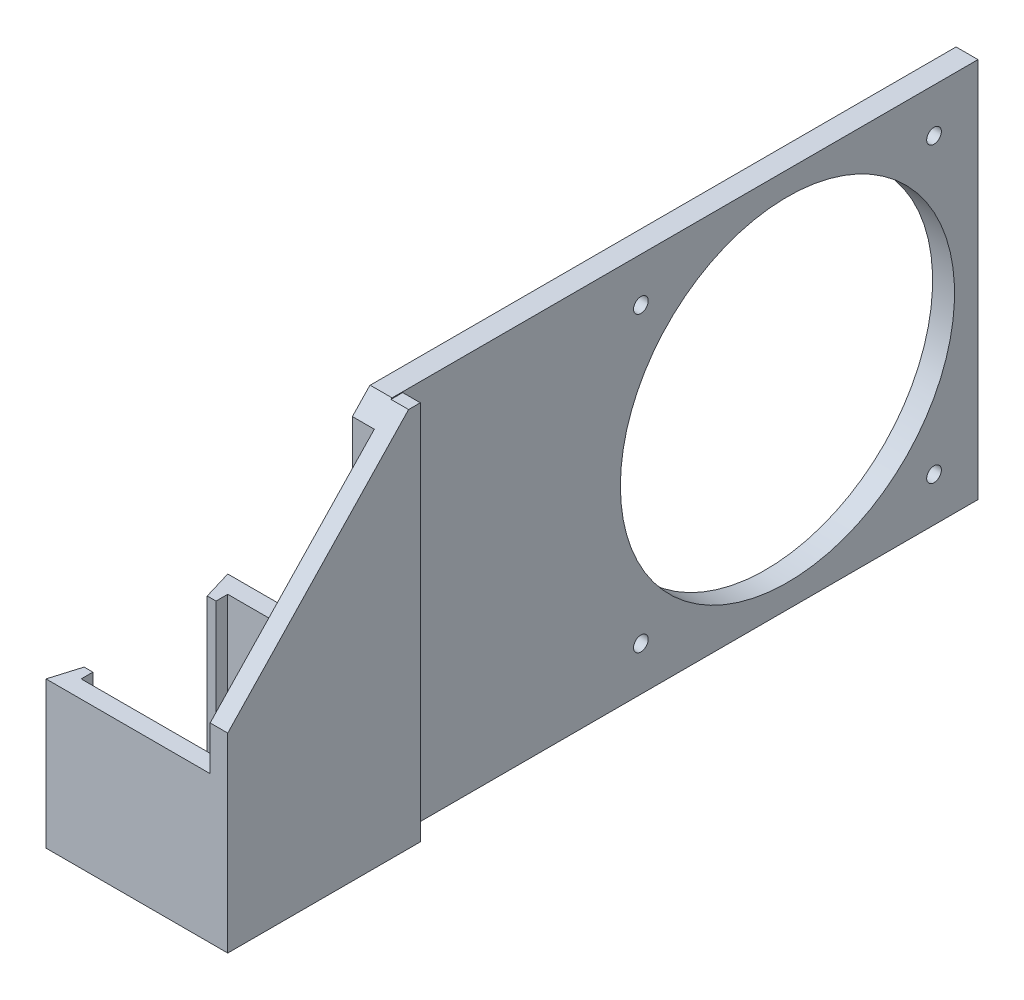
ISO-10303-21;
HEADER;
FILE_DESCRIPTION(('STEP AP214'),'2;1');
FILE_NAME('part.step','',(''),(''),'','','');
FILE_SCHEMA(('AUTOMOTIVE_DESIGN { 1 0 10303 214 1 1 1 1 }'));
ENDSEC;
DATA;
#1=APPLICATION_CONTEXT('core data for automotive mechanical design processes');
#2=APPLICATION_PROTOCOL_DEFINITION('international standard','automotive_design',2000,#1);
#3=PRODUCT_CONTEXT('',#1,'mechanical');
#4=PRODUCT('Part','Part','',(#3));
#5=PRODUCT_RELATED_PRODUCT_CATEGORY('part','',(#4));
#6=PRODUCT_DEFINITION_FORMATION('','',#4);
#7=PRODUCT_DEFINITION_CONTEXT('part definition',#1,'design');
#8=PRODUCT_DEFINITION('design','',#6,#7);
#9=PRODUCT_DEFINITION_SHAPE('','',#8);
#10=(LENGTH_UNIT() NAMED_UNIT(*) SI_UNIT(.MILLI.,.METRE.));
#11=(NAMED_UNIT(*) PLANE_ANGLE_UNIT() SI_UNIT($,.RADIAN.));
#12=(NAMED_UNIT(*) SI_UNIT($,.STERADIAN.) SOLID_ANGLE_UNIT());
#13=UNCERTAINTY_MEASURE_WITH_UNIT(LENGTH_MEASURE(1.E-05),#10,'distance_accuracy_value','');
#14=(GEOMETRIC_REPRESENTATION_CONTEXT(3) GLOBAL_UNCERTAINTY_ASSIGNED_CONTEXT((#13)) GLOBAL_UNIT_ASSIGNED_CONTEXT((#10,
#11,#12)) REPRESENTATION_CONTEXT('',''));
#15=CARTESIAN_POINT('',(0.,0.,0.));
#16=DIRECTION('',(0.,0.,1.));
#17=DIRECTION('',(1.,0.,0.));
#18=AXIS2_PLACEMENT_3D('',#15,#16,#17);
#19=CARTESIAN_POINT('',(-38.8257575757576,65.,-34.8134556664977));
#20=DIRECTION('',(-1.,0.,0.));
#21=DIRECTION('',(0.,0.,1.));
#22=AXIS2_PLACEMENT_3D('',#19,#20,#21);
#23=PLANE('',#22);
#24=CARTESIAN_POINT('',(-38.8257575757576,57.5,-77.4382664031757));
#25=DIRECTION('',(-1.,0.,0.));
#26=DIRECTION('',(0.,0.,1.));
#27=AXIS2_PLACEMENT_3D('',#24,#25,#26);
#28=CIRCLE('',#27,1.25);
#29=CARTESIAN_POINT('',(-38.8257575757576,57.5,-76.1882664031757));
#30=VERTEX_POINT('',#29);
#31=EDGE_CURVE('E278',#30,#30,#28,.F.);
#32=ORIENTED_EDGE('',*,*,#31,.F.);
#33=EDGE_LOOP('',(#32));
#34=FACE_BOUND('',#33,.T.);
#35=CARTESIAN_POINT('',(-38.8257575757576,7.49999999999999,-127.438266403176));
#36=DIRECTION('',(-1.,0.,0.));
#37=DIRECTION('',(0.,0.,1.));
#38=AXIS2_PLACEMENT_3D('',#35,#36,#37);
#39=CIRCLE('',#38,1.25000000000001);
#40=CARTESIAN_POINT('',(-38.8257575757576,7.49999999999999,-126.188266403176));
#41=VERTEX_POINT('',#40);
#42=EDGE_CURVE('E272',#41,#41,#39,.F.);
#43=ORIENTED_EDGE('',*,*,#42,.F.);
#44=EDGE_LOOP('',(#43));
#45=FACE_BOUND('',#44,.T.);
#46=CARTESIAN_POINT('',(-38.8257575757576,7.49999999999999,-77.4382664031757));
#47=DIRECTION('',(-1.,0.,0.));
#48=DIRECTION('',(0.,0.,1.));
#49=AXIS2_PLACEMENT_3D('',#46,#47,#48);
#50=CIRCLE('',#49,1.25);
#51=CARTESIAN_POINT('',(-38.8257575757576,7.49999999999999,-76.1882664031757));
#52=VERTEX_POINT('',#51);
#53=EDGE_CURVE('E271',#52,#52,#50,.F.);
#54=ORIENTED_EDGE('',*,*,#53,.F.);
#55=EDGE_LOOP('',(#54));
#56=FACE_BOUND('',#55,.T.);
#57=CARTESIAN_POINT('',(-38.8257575757576,57.5,-127.438266403176));
#58=DIRECTION('',(-1.,0.,0.));
#59=DIRECTION('',(0.,0.,1.));
#60=AXIS2_PLACEMENT_3D('',#57,#58,#59);
#61=CIRCLE('',#60,1.25000000000001);
#62=CARTESIAN_POINT('',(-38.8257575757576,57.5,-126.188266403176));
#63=VERTEX_POINT('',#62);
#64=EDGE_CURVE('E275',#63,#63,#61,.F.);
#65=ORIENTED_EDGE('',*,*,#64,.F.);
#66=EDGE_LOOP('',(#65));
#67=FACE_BOUND('',#66,.T.);
#68=CARTESIAN_POINT('',(-38.8257575757576,32.5,-102.438266403176));
#69=DIRECTION('',(-1.,0.,0.));
#70=DIRECTION('',(0.,0.,1.));
#71=AXIS2_PLACEMENT_3D('',#68,#69,#70);
#72=CIRCLE('',#71,28.5);
#73=CARTESIAN_POINT('',(-38.8257575757576,32.5,-73.9382664031757));
#74=VERTEX_POINT('',#73);
#75=EDGE_CURVE('E281',#74,#74,#72,.F.);
#76=ORIENTED_EDGE('',*,*,#75,.F.);
#77=EDGE_LOOP('',(#76));
#78=FACE_BOUND('',#77,.T.);
#79=DIRECTION('',(0.,0.,1.));
#80=VECTOR('',#79,1.);
#81=CARTESIAN_POINT('',(-38.8257575757576,64.8690170509813,-36.8134556664977));
#82=LINE('',#81,#80);
#83=CARTESIAN_POINT('',(-38.8257575757576,64.8690170509813,-36.8134556664977));
#84=VERTEX_POINT('',#83);
#85=CARTESIAN_POINT('',(-38.8257575757576,64.8690170509813,-34.8134556664977));
#86=VERTEX_POINT('',#85);
#87=EDGE_CURVE('E53',#84,#86,#82,.T.);
#88=ORIENTED_EDGE('',*,*,#87,.F.);
#89=DIRECTION('',(0.,1.,0.));
#90=VECTOR('',#89,1.);
#91=CARTESIAN_POINT('',(-38.8257575757576,64.8690170509813,-36.8134556664977));
#92=LINE('',#91,#90);
#93=CARTESIAN_POINT('',(-38.8257575757576,0.,-36.8134556664977));
#94=VERTEX_POINT('',#93);
#95=EDGE_CURVE('E57',#94,#84,#92,.T.);
#96=ORIENTED_EDGE('',*,*,#95,.F.);
#97=DIRECTION('',(0.,0.,-1.));
#98=VECTOR('',#97,1.);
#99=CARTESIAN_POINT('',(-38.8257575757576,0.,-34.8134556664977));
#100=LINE('',#99,#98);
#101=CARTESIAN_POINT('',(-38.8257575757576,0.,-134.938266403176));
#102=VERTEX_POINT('',#101);
#103=EDGE_CURVE('E202',#94,#102,#100,.T.);
#104=ORIENTED_EDGE('',*,*,#103,.T.);
#105=DIRECTION('',(0.,-1.,0.));
#106=VECTOR('',#105,1.);
#107=CARTESIAN_POINT('',(-38.8257575757576,65.,-134.938266403176));
#108=LINE('',#107,#106);
#109=CARTESIAN_POINT('',(-38.8257575757576,65.,-134.938266403176));
#110=VERTEX_POINT('',#109);
#111=EDGE_CURVE('E267',#110,#102,#108,.T.);
#112=ORIENTED_EDGE('',*,*,#111,.F.);
#113=DIRECTION('',(0.,0.,-1.));
#114=VECTOR('',#113,1.);
#115=CARTESIAN_POINT('',(-38.8257575757576,65.,-34.8134556664977));
#116=LINE('',#115,#114);
#117=CARTESIAN_POINT('',(-38.8257575757576,65.,-34.9697397940122));
#118=VERTEX_POINT('',#117);
#119=EDGE_CURVE('E265',#118,#110,#116,.T.);
#120=ORIENTED_EDGE('',*,*,#119,.F.);
#121=DIRECTION('',(0.,-1.,0.));
#122=VECTOR('',#121,1.);
#123=CARTESIAN_POINT('',(-38.8257575757576,69.3298478640681,-34.9697397940122));
#124=LINE('',#123,#122);
#125=CARTESIAN_POINT('',(-38.8257575757576,65.0330298310635,-34.9697397940122));
#126=VERTEX_POINT('',#125);
#127=EDGE_CURVE('E231',#126,#118,#124,.T.);
#128=ORIENTED_EDGE('',*,*,#127,.F.);
#129=DIRECTION('',(0.,-0.72395829288421,0.689843743295669));
#130=VECTOR('',#129,1.);
#131=CARTESIAN_POINT('',(-38.8257575757576,67.2850592347853,-37.1156484867437));
#132=LINE('',#131,#130);
#133=EDGE_CURVE('E217',#126,#86,#132,.T.);
#134=ORIENTED_EDGE('',*,*,#133,.T.);
#135=EDGE_LOOP('',(#88,#96,#104,#112,#120,#128,#134));
#136=FACE_BOUND('',#135,.T.);
#137=ADVANCED_FACE('F37',(#34,#45,#56,#67,#78,#136),#23,.F.);
#138=CARTESIAN_POINT('',(0.,25.,0.));
#139=DIRECTION('',(0.,1.,0.));
#140=DIRECTION('',(0.,0.,1.));
#141=AXIS2_PLACEMENT_3D('',#138,#139,#140);
#142=PLANE('',#141);
#143=DIRECTION('',(1.,0.,0.));
#144=VECTOR('',#143,1.);
#145=CARTESIAN_POINT('',(-63.8257575757576,25.,-31.9697397940122));
#146=LINE('',#145,#144);
#147=CARTESIAN_POINT('',(-63.8257575757576,25.,-31.9697397940122));
#148=VERTEX_POINT('',#147);
#149=CARTESIAN_POINT('',(-42.5643312219053,25.,-31.9697397940122));
#150=VERTEX_POINT('',#149);
#151=EDGE_CURVE('E323',#148,#150,#146,.T.);
#152=ORIENTED_EDGE('',*,*,#151,.T.);
#153=DIRECTION('',(0.,0.,1.));
#154=VECTOR('',#153,1.);
#155=CARTESIAN_POINT('',(-42.5643312219053,25.,-34.9697397940122));
#156=LINE('',#155,#154);
#157=CARTESIAN_POINT('',(-42.5643312219053,25.,-44.9697397940123));
#158=VERTEX_POINT('',#157);
#159=EDGE_CURVE('E216',#158,#150,#156,.T.);
#160=ORIENTED_EDGE('',*,*,#159,.F.);
#161=DIRECTION('',(-0.707106781186544,0.,0.707106781186551));
#162=VECTOR('',#161,1.);
#163=CARTESIAN_POINT('',(-42.5643312219053,25.,-44.9697397940123));
#164=LINE('',#163,#162);
#165=CARTESIAN_POINT('',(-52.5643312219053,25.,-34.9697397940122));
#166=VERTEX_POINT('',#165);
#167=EDGE_CURVE('E46',#158,#166,#164,.T.);
#168=ORIENTED_EDGE('',*,*,#167,.T.);
#169=DIRECTION('',(-1.,0.,0.));
#170=VECTOR('',#169,1.);
#171=CARTESIAN_POINT('',(-36.5790075050805,25.,-34.9697397940122));
#172=LINE('',#171,#170);
#173=CARTESIAN_POINT('',(-66.8257575757576,25.,-34.9697397940122));
#174=VERTEX_POINT('',#173);
#175=EDGE_CURVE('E316',#166,#174,#172,.T.);
#176=ORIENTED_EDGE('',*,*,#175,.T.);
#177=DIRECTION('',(0.287347885566346,0.,0.957826285221151));
#178=VECTOR('',#177,1.);
#179=CARTESIAN_POINT('',(-66.8257575757576,25.,-34.9697397940122));
#180=LINE('',#179,#178);
#181=CARTESIAN_POINT('',(-65.3257575757576,25.,-29.9697397940122));
#182=VERTEX_POINT('',#181);
#183=EDGE_CURVE('E310',#174,#182,#180,.T.);
#184=ORIENTED_EDGE('',*,*,#183,.T.);
#185=DIRECTION('',(1.,0.,0.));
#186=VECTOR('',#185,1.);
#187=CARTESIAN_POINT('',(-66.8257575757576,25.,-29.9697397940122));
#188=LINE('',#187,#186);
#189=CARTESIAN_POINT('',(-63.8257575757576,25.,-29.9697397940122));
#190=VERTEX_POINT('',#189);
#191=EDGE_CURVE('E318',#182,#190,#188,.T.);
#192=ORIENTED_EDGE('',*,*,#191,.T.);
#193=DIRECTION('',(0.,0.,-1.));
#194=VECTOR('',#193,1.);
#195=CARTESIAN_POINT('',(-63.8257575757576,25.,-29.9697397940122));
#196=LINE('',#195,#194);
#197=EDGE_CURVE('E321',#190,#148,#196,.T.);
#198=ORIENTED_EDGE('',*,*,#197,.T.);
#199=EDGE_LOOP('',(#152,#160,#168,#176,#184,#192,#198));
#200=FACE_BOUND('',#199,.T.);
#201=ADVANCED_FACE('F389',(#200),#142,.T.);
#202=CARTESIAN_POINT('',(-38.8257575757576,25.,-31.9697397940122));
#203=DIRECTION('',(1.,0.,0.));
#204=DIRECTION('',(0.,0.,-1.));
#205=AXIS2_PLACEMENT_3D('',#202,#203,#204);
#206=PLANE('',#205);
#207=DIRECTION('',(0.,0.72395829288421,-0.689843743295669));
#208=VECTOR('',#207,1.);
#209=CARTESIAN_POINT('',(-38.8257575757576,42.5528396913205,-13.5488669779603));
#210=LINE('',#209,#208);
#211=CARTESIAN_POINT('',(-38.8257575757576,32.5,-3.96973979401218));
#212=VERTEX_POINT('',#211);
#213=CARTESIAN_POINT('',(-38.8257575757576,61.8846721054767,-31.9697397940122));
#214=VERTEX_POINT('',#213);
#215=EDGE_CURVE('E287',#212,#214,#210,.T.);
#216=ORIENTED_EDGE('',*,*,#215,.T.);
#217=DIRECTION('',(0.,-1.,0.));
#218=VECTOR('',#217,1.);
#219=CARTESIAN_POINT('',(-38.8257575757576,25.,-31.9697397940122));
#220=LINE('',#219,#218);
#221=CARTESIAN_POINT('',(-38.8257575757576,0.,-31.9697397940122));
#222=VERTEX_POINT('',#221);
#223=EDGE_CURVE('E365',#214,#222,#220,.T.);
#224=ORIENTED_EDGE('',*,*,#223,.T.);
#225=DIRECTION('',(0.,0.,1.));
#226=VECTOR('',#225,1.);
#227=CARTESIAN_POINT('',(-38.8257575757576,0.,-31.9697397940122));
#228=LINE('',#227,#226);
#229=CARTESIAN_POINT('',(-38.8257575757576,0.,-6.96973979401218));
#230=VERTEX_POINT('',#229);
#231=EDGE_CURVE('E344',#222,#230,#228,.T.);
#232=ORIENTED_EDGE('',*,*,#231,.T.);
#233=DIRECTION('',(0.,-1.,0.));
#234=VECTOR('',#233,1.);
#235=CARTESIAN_POINT('',(-38.8257575757576,25.,-6.96973979401218));
#236=LINE('',#235,#234);
#237=CARTESIAN_POINT('',(-38.8257575757576,25.,-6.96973979401218));
#238=VERTEX_POINT('',#237);
#239=EDGE_CURVE('E362',#238,#230,#236,.T.);
#240=ORIENTED_EDGE('',*,*,#239,.F.);
#241=DIRECTION('',(0.,0.,1.));
#242=VECTOR('',#241,1.);
#243=CARTESIAN_POINT('',(-38.8257575757576,25.,-34.9382664031757));
#244=LINE('',#243,#242);
#245=CARTESIAN_POINT('',(-38.8257575757576,25.,-3.96973979401218));
#246=VERTEX_POINT('',#245);
#247=EDGE_CURVE('E290',#238,#246,#244,.T.);
#248=ORIENTED_EDGE('',*,*,#247,.T.);
#249=DIRECTION('',(0.,-1.,0.));
#250=VECTOR('',#249,1.);
#251=CARTESIAN_POINT('',(-38.8257575757576,96.3738505099248,-3.96973979401218));
#252=LINE('',#251,#250);
#253=EDGE_CURVE('E293',#212,#246,#252,.T.);
#254=ORIENTED_EDGE('',*,*,#253,.F.);
#255=EDGE_LOOP('',(#216,#224,#232,#240,#248,#254));
#256=FACE_BOUND('',#255,.T.);
#257=ADVANCED_FACE('F426',(#256),#206,.F.);
#258=CARTESIAN_POINT('',(-36.7989439252784,65.,-134.938266403176));
#259=DIRECTION('',(0.,-1.,0.));
#260=DIRECTION('',(0.,0.,-1.));
#261=AXIS2_PLACEMENT_3D('',#258,#259,#260);
#262=PLANE('',#261);
#263=DIRECTION('',(1.,0.,0.));
#264=VECTOR('',#263,1.);
#265=CARTESIAN_POINT('',(-42.5643312219053,65.,-34.9697397940122));
#266=LINE('',#265,#264);
#267=CARTESIAN_POINT('',(-42.5643312219053,65.,-34.9697397940122));
#268=VERTEX_POINT('',#267);
#269=EDGE_CURVE('E195',#268,#118,#266,.T.);
#270=ORIENTED_EDGE('',*,*,#269,.T.);
#271=ORIENTED_EDGE('',*,*,#119,.T.);
#272=DIRECTION('',(1.,0.,0.));
#273=VECTOR('',#272,1.);
#274=CARTESIAN_POINT('',(-36.7989439252784,65.,-134.938266403176));
#275=LINE('',#274,#273);
#276=CARTESIAN_POINT('',(-42.5643312219053,65.,-134.938266403176));
#277=VERTEX_POINT('',#276);
#278=EDGE_CURVE('E297',#277,#110,#275,.T.);
#279=ORIENTED_EDGE('',*,*,#278,.F.);
#280=DIRECTION('',(0.,0.,-1.));
#281=VECTOR('',#280,1.);
#282=CARTESIAN_POINT('',(-42.5643312219053,65.,-134.938266403176));
#283=LINE('',#282,#281);
#284=EDGE_CURVE('E258',#268,#277,#283,.T.);
#285=ORIENTED_EDGE('',*,*,#284,.F.);
#286=EDGE_LOOP('',(#270,#271,#279,#285));
#287=FACE_BOUND('',#286,.T.);
#288=ADVANCED_FACE('F411',(#287),#262,.F.);
#289=DIRECTION('',(1.,0.,0.));
#290=VECTOR('',#289,1.);
#291=CARTESIAN_POINT('',(-66.8257575757576,25.,-3.96973979401218));
#292=LINE('',#291,#290);
#293=CARTESIAN_POINT('',(-66.8257575757576,25.,-3.96973979401218));
#294=VERTEX_POINT('',#293);
#295=EDGE_CURVE('E333',#294,#246,#292,.T.);
#296=ORIENTED_EDGE('',*,*,#295,.T.);
#297=ORIENTED_EDGE('',*,*,#247,.F.);
#298=DIRECTION('',(-1.,0.,0.));
#299=VECTOR('',#298,1.);
#300=CARTESIAN_POINT('',(-38.8257575757576,25.,-6.96973979401218));
#301=LINE('',#300,#299);
#302=CARTESIAN_POINT('',(-63.8257575757576,25.,-6.96973979401218));
#303=VERTEX_POINT('',#302);
#304=EDGE_CURVE('E326',#238,#303,#301,.T.);
#305=ORIENTED_EDGE('',*,*,#304,.T.);
#306=DIRECTION('',(0.,0.,-1.));
#307=VECTOR('',#306,1.);
#308=CARTESIAN_POINT('',(-63.8257575757576,25.,-6.96973979401218));
#309=LINE('',#308,#307);
#310=CARTESIAN_POINT('',(-63.8257575757576,25.,-8.96973979401218));
#311=VERTEX_POINT('',#310);
#312=EDGE_CURVE('E328',#303,#311,#309,.T.);
#313=ORIENTED_EDGE('',*,*,#312,.T.);
#314=DIRECTION('',(-1.,0.,0.));
#315=VECTOR('',#314,1.);
#316=CARTESIAN_POINT('',(-63.8257575757576,25.,-8.96973979401218));
#317=LINE('',#316,#315);
#318=CARTESIAN_POINT('',(-65.3257575757576,25.,-8.96973979401218));
#319=VERTEX_POINT('',#318);
#320=EDGE_CURVE('E330',#311,#319,#317,.T.);
#321=ORIENTED_EDGE('',*,*,#320,.T.);
#322=DIRECTION('',(-0.287347885566346,0.,0.957826285221151));
#323=VECTOR('',#322,1.);
#324=CARTESIAN_POINT('',(-66.8257575757576,25.,-3.96973979401218));
#325=LINE('',#324,#323);
#326=EDGE_CURVE('E301',#319,#294,#325,.T.);
#327=ORIENTED_EDGE('',*,*,#326,.T.);
#328=EDGE_LOOP('',(#296,#297,#305,#313,#321,#327));
#329=FACE_BOUND('',#328,.T.);
#330=ADVANCED_FACE('F450',(#329),#142,.T.);
#331=CARTESIAN_POINT('',(-36.5790075050805,25.,-34.9697397940122));
#332=DIRECTION('',(0.,0.,1.));
#333=DIRECTION('',(1.,0.,0.));
#334=AXIS2_PLACEMENT_3D('',#331,#332,#333);
#335=PLANE('',#334);
#336=ORIENTED_EDGE('',*,*,#175,.F.);
#337=DIRECTION('',(0.,-1.,0.));
#338=VECTOR('',#337,1.);
#339=CARTESIAN_POINT('',(-52.5643312219053,25.,-34.9697397940122));
#340=LINE('',#339,#338);
#341=CARTESIAN_POINT('',(-52.5643312219053,0.,-34.9697397940122));
#342=VERTEX_POINT('',#341);
#343=EDGE_CURVE('E385',#166,#342,#340,.T.);
#344=ORIENTED_EDGE('',*,*,#343,.T.);
#345=DIRECTION('',(-1.,0.,0.));
#346=VECTOR('',#345,1.);
#347=CARTESIAN_POINT('',(-36.5790075050805,0.,-34.9697397940122));
#348=LINE('',#347,#346);
#349=CARTESIAN_POINT('',(-66.8257575757576,0.,-34.9697397940122));
#350=VERTEX_POINT('',#349);
#351=EDGE_CURVE('E309',#342,#350,#348,.T.);
#352=ORIENTED_EDGE('',*,*,#351,.T.);
#353=DIRECTION('',(0.,-1.,0.));
#354=VECTOR('',#353,1.);
#355=CARTESIAN_POINT('',(-66.8257575757576,25.,-34.9697397940122));
#356=LINE('',#355,#354);
#357=EDGE_CURVE('E374',#174,#350,#356,.T.);
#358=ORIENTED_EDGE('',*,*,#357,.F.);
#359=EDGE_LOOP('',(#336,#344,#352,#358));
#360=FACE_BOUND('',#359,.T.);
#361=ADVANCED_FACE('F396',(#360),#335,.F.);
#362=CARTESIAN_POINT('',(-66.8257575757576,25.,-29.9697397940122));
#363=DIRECTION('',(0.,0.,-1.));
#364=DIRECTION('',(-1.,0.,0.));
#365=AXIS2_PLACEMENT_3D('',#362,#363,#364);
#366=PLANE('',#365);
#367=ORIENTED_EDGE('',*,*,#191,.F.);
#368=DIRECTION('',(0.,-1.,0.));
#369=VECTOR('',#368,1.);
#370=CARTESIAN_POINT('',(-65.3257575757576,25.,-29.9697397940122));
#371=LINE('',#370,#369);
#372=CARTESIAN_POINT('',(-65.3257575757576,0.,-29.9697397940122));
#373=VERTEX_POINT('',#372);
#374=EDGE_CURVE('E307',#182,#373,#371,.T.);
#375=ORIENTED_EDGE('',*,*,#374,.T.);
#376=DIRECTION('',(1.,0.,0.));
#377=VECTOR('',#376,1.);
#378=CARTESIAN_POINT('',(-66.8257575757576,0.,-29.9697397940122));
#379=LINE('',#378,#377);
#380=CARTESIAN_POINT('',(-63.8257575757576,0.,-29.9697397940122));
#381=VERTEX_POINT('',#380);
#382=EDGE_CURVE('E338',#373,#381,#379,.T.);
#383=ORIENTED_EDGE('',*,*,#382,.T.);
#384=DIRECTION('',(0.,-1.,0.));
#385=VECTOR('',#384,1.);
#386=CARTESIAN_POINT('',(-63.8257575757576,25.,-29.9697397940122));
#387=LINE('',#386,#385);
#388=EDGE_CURVE('E371',#190,#381,#387,.T.);
#389=ORIENTED_EDGE('',*,*,#388,.F.);
#390=EDGE_LOOP('',(#367,#375,#383,#389));
#391=FACE_BOUND('',#390,.T.);
#392=ADVANCED_FACE('F515',(#391),#366,.F.);
#393=CARTESIAN_POINT('',(-63.8257575757576,25.,-29.9697397940122));
#394=DIRECTION('',(-1.,0.,0.));
#395=DIRECTION('',(0.,0.,1.));
#396=AXIS2_PLACEMENT_3D('',#393,#394,#395);
#397=PLANE('',#396);
#398=DIRECTION('',(0.,0.,-1.));
#399=VECTOR('',#398,1.);
#400=CARTESIAN_POINT('',(-63.8257575757576,0.,-29.9697397940122));
#401=LINE('',#400,#399);
#402=CARTESIAN_POINT('',(-63.8257575757576,0.,-31.9697397940122));
#403=VERTEX_POINT('',#402);
#404=EDGE_CURVE('E340',#381,#403,#401,.T.);
#405=ORIENTED_EDGE('',*,*,#404,.T.);
#406=DIRECTION('',(0.,-1.,0.));
#407=VECTOR('',#406,1.);
#408=CARTESIAN_POINT('',(-63.8257575757576,25.,-31.9697397940122));
#409=LINE('',#408,#407);
#410=EDGE_CURVE('E368',#148,#403,#409,.T.);
#411=ORIENTED_EDGE('',*,*,#410,.F.);
#412=ORIENTED_EDGE('',*,*,#197,.F.);
#413=ORIENTED_EDGE('',*,*,#388,.T.);
#414=EDGE_LOOP('',(#405,#411,#412,#413));
#415=FACE_BOUND('',#414,.T.);
#416=ADVANCED_FACE('F512',(#415),#397,.F.);
#417=CARTESIAN_POINT('',(-63.8257575757576,25.,-31.9697397940122));
#418=DIRECTION('',(0.,0.,-1.));
#419=DIRECTION('',(-1.,0.,0.));
#420=AXIS2_PLACEMENT_3D('',#417,#418,#419);
#421=PLANE('',#420);
#422=DIRECTION('',(1.,0.,0.));
#423=VECTOR('',#422,1.);
#424=CARTESIAN_POINT('',(-63.8257575757576,0.,-31.9697397940122));
#425=LINE('',#424,#423);
#426=EDGE_CURVE('E342',#403,#222,#425,.T.);
#427=ORIENTED_EDGE('',*,*,#426,.T.);
#428=ORIENTED_EDGE('',*,*,#223,.F.);
#429=DIRECTION('',(-1.,0.,0.));
#430=VECTOR('',#429,1.);
#431=CARTESIAN_POINT('',(-42.5643312219053,61.8846721054767,-31.9697397940122));
#432=LINE('',#431,#430);
#433=CARTESIAN_POINT('',(-42.5643312219053,61.8846721054767,-31.9697397940122));
#434=VERTEX_POINT('',#433);
#435=EDGE_CURVE('E219',#214,#434,#432,.T.);
#436=ORIENTED_EDGE('',*,*,#435,.T.);
#437=DIRECTION('',(0.,-1.,0.));
#438=VECTOR('',#437,1.);
#439=CARTESIAN_POINT('',(-42.5643312219053,69.3298478640681,-31.9697397940122));
#440=LINE('',#439,#438);
#441=EDGE_CURVE('E234',#434,#150,#440,.T.);
#442=ORIENTED_EDGE('',*,*,#441,.T.);
#443=ORIENTED_EDGE('',*,*,#151,.F.);
#444=ORIENTED_EDGE('',*,*,#410,.T.);
#445=EDGE_LOOP('',(#427,#428,#436,#442,#443,#444));
#446=FACE_BOUND('',#445,.T.);
#447=ADVANCED_FACE('F422',(#446),#421,.F.);
#448=CARTESIAN_POINT('',(-38.8257575757576,25.,-6.96973979401218));
#449=DIRECTION('',(0.,0.,1.));
#450=DIRECTION('',(1.,0.,0.));
#451=AXIS2_PLACEMENT_3D('',#448,#449,#450);
#452=PLANE('',#451);
#453=DIRECTION('',(-1.,0.,0.));
#454=VECTOR('',#453,1.);
#455=CARTESIAN_POINT('',(-38.8257575757576,0.,-6.96973979401218));
#456=LINE('',#455,#454);
#457=CARTESIAN_POINT('',(-63.8257575757576,0.,-6.96973979401218));
#458=VERTEX_POINT('',#457);
#459=EDGE_CURVE('E346',#230,#458,#456,.T.);
#460=ORIENTED_EDGE('',*,*,#459,.T.);
#461=DIRECTION('',(0.,-1.,0.));
#462=VECTOR('',#461,1.);
#463=CARTESIAN_POINT('',(-63.8257575757576,25.,-6.96973979401218));
#464=LINE('',#463,#462);
#465=EDGE_CURVE('E359',#303,#458,#464,.T.);
#466=ORIENTED_EDGE('',*,*,#465,.F.);
#467=ORIENTED_EDGE('',*,*,#304,.F.);
#468=ORIENTED_EDGE('',*,*,#239,.T.);
#469=EDGE_LOOP('',(#460,#466,#467,#468));
#470=FACE_BOUND('',#469,.T.);
#471=ADVANCED_FACE('F503',(#470),#452,.F.);
#472=CARTESIAN_POINT('',(-63.8257575757576,25.,-6.96973979401218));
#473=DIRECTION('',(-1.,0.,0.));
#474=DIRECTION('',(0.,0.,1.));
#475=AXIS2_PLACEMENT_3D('',#472,#473,#474);
#476=PLANE('',#475);
#477=DIRECTION('',(0.,0.,-1.));
#478=VECTOR('',#477,1.);
#479=CARTESIAN_POINT('',(-63.8257575757576,0.,-6.96973979401218));
#480=LINE('',#479,#478);
#481=CARTESIAN_POINT('',(-63.8257575757576,0.,-8.96973979401218));
#482=VERTEX_POINT('',#481);
#483=EDGE_CURVE('E348',#458,#482,#480,.T.);
#484=ORIENTED_EDGE('',*,*,#483,.T.);
#485=DIRECTION('',(0.,-1.,0.));
#486=VECTOR('',#485,1.);
#487=CARTESIAN_POINT('',(-63.8257575757576,25.,-8.96973979401218));
#488=LINE('',#487,#486);
#489=EDGE_CURVE('E356',#311,#482,#488,.T.);
#490=ORIENTED_EDGE('',*,*,#489,.F.);
#491=ORIENTED_EDGE('',*,*,#312,.F.);
#492=ORIENTED_EDGE('',*,*,#465,.T.);
#493=EDGE_LOOP('',(#484,#490,#491,#492));
#494=FACE_BOUND('',#493,.T.);
#495=ADVANCED_FACE('F499',(#494),#476,.F.);
#496=CARTESIAN_POINT('',(-63.8257575757576,25.,-8.96973979401218));
#497=DIRECTION('',(0.,0.,1.));
#498=DIRECTION('',(1.,0.,0.));
#499=AXIS2_PLACEMENT_3D('',#496,#497,#498);
#500=PLANE('',#499);
#501=DIRECTION('',(-1.,0.,0.));
#502=VECTOR('',#501,1.);
#503=CARTESIAN_POINT('',(-63.8257575757576,0.,-8.96973979401218));
#504=LINE('',#503,#502);
#505=CARTESIAN_POINT('',(-65.3257575757576,0.,-8.96973979401218));
#506=VERTEX_POINT('',#505);
#507=EDGE_CURVE('E350',#482,#506,#504,.T.);
#508=ORIENTED_EDGE('',*,*,#507,.T.);
#509=DIRECTION('',(0.,-1.,0.));
#510=VECTOR('',#509,1.);
#511=CARTESIAN_POINT('',(-65.3257575757576,25.,-8.96973979401218));
#512=LINE('',#511,#510);
#513=EDGE_CURVE('E304',#319,#506,#512,.T.);
#514=ORIENTED_EDGE('',*,*,#513,.F.);
#515=ORIENTED_EDGE('',*,*,#320,.F.);
#516=ORIENTED_EDGE('',*,*,#489,.T.);
#517=EDGE_LOOP('',(#508,#514,#515,#516));
#518=FACE_BOUND('',#517,.T.);
#519=ADVANCED_FACE('F496',(#518),#500,.F.);
#520=CARTESIAN_POINT('',(-66.8257575757576,25.,-3.96973979401218));
#521=DIRECTION('',(0.,0.,-1.));
#522=DIRECTION('',(-1.,0.,0.));
#523=AXIS2_PLACEMENT_3D('',#520,#521,#522);
#524=PLANE('',#523);
#525=DIRECTION('',(1.,0.,0.));
#526=VECTOR('',#525,1.);
#527=CARTESIAN_POINT('',(-66.8257575757576,0.,-3.96973979401218));
#528=LINE('',#527,#526);
#529=CARTESIAN_POINT('',(-66.8257575757576,0.,-3.96973979401218));
#530=VERTEX_POINT('',#529);
#531=CARTESIAN_POINT('',(-35.8257575757576,0.,-3.96973979401218));
#532=VERTEX_POINT('',#531);
#533=EDGE_CURVE('E319',#530,#532,#528,.T.);
#534=ORIENTED_EDGE('',*,*,#533,.T.);
#535=DIRECTION('',(0.,-1.,0.));
#536=VECTOR('',#535,1.);
#537=CARTESIAN_POINT('',(-35.8257575757576,65.,-3.96973979401218));
#538=LINE('',#537,#536);
#539=CARTESIAN_POINT('',(-35.8257575757576,32.5,-3.96973979401218));
#540=VERTEX_POINT('',#539);
#541=EDGE_CURVE('E191',#540,#532,#538,.T.);
#542=ORIENTED_EDGE('',*,*,#541,.F.);
#543=DIRECTION('',(1.,0.,0.));
#544=VECTOR('',#543,1.);
#545=CARTESIAN_POINT('',(-133.798943925278,32.5,-3.96973979401218));
#546=LINE('',#545,#544);
#547=EDGE_CURVE('E284',#212,#540,#546,.T.);
#548=ORIENTED_EDGE('',*,*,#547,.F.);
#549=ORIENTED_EDGE('',*,*,#253,.T.);
#550=ORIENTED_EDGE('',*,*,#295,.F.);
#551=DIRECTION('',(0.,-1.,0.));
#552=VECTOR('',#551,1.);
#553=CARTESIAN_POINT('',(-66.8257575757576,25.,-3.96973979401218));
#554=LINE('',#553,#552);
#555=EDGE_CURVE('E336',#294,#530,#554,.T.);
#556=ORIENTED_EDGE('',*,*,#555,.T.);
#557=EDGE_LOOP('',(#534,#542,#548,#549,#550,#556));
#558=FACE_BOUND('',#557,.T.);
#559=ADVANCED_FACE('F431',(#558),#524,.F.);
#560=CARTESIAN_POINT('',(0.,0.,0.));
#561=DIRECTION('',(0.,1.,0.));
#562=DIRECTION('',(0.,0.,1.));
#563=AXIS2_PLACEMENT_3D('',#560,#561,#562);
#564=PLANE('',#563);
#565=ORIENTED_EDGE('',*,*,#351,.F.);
#566=DIRECTION('',(0.707106781186544,0.,-0.707106781186551));
#567=VECTOR('',#566,1.);
#568=CARTESIAN_POINT('',(-43.767035507959,0.,-43.7670355079585));
#569=LINE('',#568,#567);
#570=CARTESIAN_POINT('',(-42.5643312219053,0.,-44.9697397940123));
#571=VERTEX_POINT('',#570);
#572=EDGE_CURVE('E11',#342,#571,#569,.T.);
#573=ORIENTED_EDGE('',*,*,#572,.T.);
#574=DIRECTION('',(0.,0.,1.));
#575=VECTOR('',#574,1.);
#576=CARTESIAN_POINT('',(-42.5643312219053,0.,-134.938266403176));
#577=LINE('',#576,#575);
#578=CARTESIAN_POINT('',(-42.5643312219053,0.,-134.938266403176));
#579=VERTEX_POINT('',#578);
#580=EDGE_CURVE('E255',#579,#571,#577,.T.);
#581=ORIENTED_EDGE('',*,*,#580,.F.);
#582=DIRECTION('',(-1.,0.,0.));
#583=VECTOR('',#582,1.);
#584=CARTESIAN_POINT('',(-36.7989439252784,0.,-134.938266403176));
#585=LINE('',#584,#583);
#586=EDGE_CURVE('E295',#102,#579,#585,.T.);
#587=ORIENTED_EDGE('',*,*,#586,.F.);
#588=ORIENTED_EDGE('',*,*,#103,.F.);
#589=DIRECTION('',(-1.,0.,0.));
#590=VECTOR('',#589,1.);
#591=CARTESIAN_POINT('',(-35.8257575757576,0.,-36.8134556664977));
#592=LINE('',#591,#590);
#593=CARTESIAN_POINT('',(-35.8257575757576,0.,-36.8134556664977));
#594=VERTEX_POINT('',#593);
#595=EDGE_CURVE('E198',#594,#94,#592,.T.);
#596=ORIENTED_EDGE('',*,*,#595,.F.);
#597=DIRECTION('',(0.,0.,-1.));
#598=VECTOR('',#597,1.);
#599=CARTESIAN_POINT('',(-35.8257575757576,0.,-3.96973979401218));
#600=LINE('',#599,#598);
#601=EDGE_CURVE('E184',#532,#594,#600,.T.);
#602=ORIENTED_EDGE('',*,*,#601,.F.);
#603=ORIENTED_EDGE('',*,*,#533,.F.);
#604=DIRECTION('',(-0.287347885566346,0.,0.957826285221151));
#605=VECTOR('',#604,1.);
#606=CARTESIAN_POINT('',(-66.8257575757576,0.,-3.96973979401218));
#607=LINE('',#606,#605);
#608=EDGE_CURVE('E305',#506,#530,#607,.T.);
#609=ORIENTED_EDGE('',*,*,#608,.F.);
#610=ORIENTED_EDGE('',*,*,#507,.F.);
#611=ORIENTED_EDGE('',*,*,#483,.F.);
#612=ORIENTED_EDGE('',*,*,#459,.F.);
#613=ORIENTED_EDGE('',*,*,#231,.F.);
#614=ORIENTED_EDGE('',*,*,#426,.F.);
#615=ORIENTED_EDGE('',*,*,#404,.F.);
#616=ORIENTED_EDGE('',*,*,#382,.F.);
#617=DIRECTION('',(0.287347885566346,0.,0.957826285221151));
#618=VECTOR('',#617,1.);
#619=CARTESIAN_POINT('',(-66.8257575757576,0.,-34.9697397940122));
#620=LINE('',#619,#618);
#621=EDGE_CURVE('E300',#350,#373,#620,.T.);
#622=ORIENTED_EDGE('',*,*,#621,.F.);
#623=EDGE_LOOP('',(#565,#573,#581,#587,#588,#596,#602,#603,#609,#610,#611,#612,#613,#614,#615,
#616,#622));
#624=FACE_BOUND('',#623,.T.);
#625=ADVANCED_FACE('F200',(#624),#564,.F.);
#626=CARTESIAN_POINT('',(-66.8257575757576,25.,-34.9697397940122));
#627=DIRECTION('',(0.957826285221151,0.,-0.287347885566346));
#628=DIRECTION('',(-0.287347885566346,0.,-0.957826285221151));
#629=AXIS2_PLACEMENT_3D('',#626,#627,#628);
#630=PLANE('',#629);
#631=ORIENTED_EDGE('',*,*,#621,.T.);
#632=ORIENTED_EDGE('',*,*,#374,.F.);
#633=ORIENTED_EDGE('',*,*,#183,.F.);
#634=ORIENTED_EDGE('',*,*,#357,.T.);
#635=EDGE_LOOP('',(#631,#632,#633,#634));
#636=FACE_BOUND('',#635,.T.);
#637=ADVANCED_FACE('F485',(#636),#630,.F.);
#638=CARTESIAN_POINT('',(-66.8257575757576,25.,-3.96973979401218));
#639=DIRECTION('',(0.957826285221151,0.,0.287347885566346));
#640=DIRECTION('',(0.287347885566346,0.,-0.957826285221151));
#641=AXIS2_PLACEMENT_3D('',#638,#639,#640);
#642=PLANE('',#641);
#643=ORIENTED_EDGE('',*,*,#608,.T.);
#644=ORIENTED_EDGE('',*,*,#555,.F.);
#645=ORIENTED_EDGE('',*,*,#326,.F.);
#646=ORIENTED_EDGE('',*,*,#513,.T.);
#647=EDGE_LOOP('',(#643,#644,#645,#646));
#648=FACE_BOUND('',#647,.T.);
#649=ADVANCED_FACE('F480',(#648),#642,.F.);
#650=CARTESIAN_POINT('',(0.,0.,-134.938266403176));
#651=DIRECTION('',(0.,0.,1.));
#652=DIRECTION('',(1.,0.,0.));
#653=AXIS2_PLACEMENT_3D('',#650,#651,#652);
#654=PLANE('',#653);
#655=ORIENTED_EDGE('',*,*,#278,.T.);
#656=ORIENTED_EDGE('',*,*,#111,.T.);
#657=ORIENTED_EDGE('',*,*,#586,.T.);
#658=DIRECTION('',(0.,-1.,0.));
#659=VECTOR('',#658,1.);
#660=CARTESIAN_POINT('',(-42.5643312219053,65.,-134.938266403176));
#661=LINE('',#660,#659);
#662=EDGE_CURVE('E252',#277,#579,#661,.T.);
#663=ORIENTED_EDGE('',*,*,#662,.F.);
#664=EDGE_LOOP('',(#655,#656,#657,#663));
#665=FACE_BOUND('',#664,.T.);
#666=ADVANCED_FACE('F406',(#665),#654,.F.);
#667=CARTESIAN_POINT('',(-133.798943925278,65.,-34.9382664031757));
#668=DIRECTION('',(0.,-0.689843743295669,-0.72395829288421));
#669=DIRECTION('',(0.,0.72395829288421,-0.689843743295669));
#670=AXIS2_PLACEMENT_3D('',#667,#668,#669);
#671=PLANE('',#670);
#672=DIRECTION('',(-1.,0.,0.));
#673=VECTOR('',#672,1.);
#674=CARTESIAN_POINT('',(-133.798943925278,64.8690170509813,-34.8134556664977));
#675=LINE('',#674,#673);
#676=CARTESIAN_POINT('',(-35.8257575757576,64.8690170509813,-34.8134556664977));
#677=VERTEX_POINT('',#676);
#678=EDGE_CURVE('E377',#677,#86,#675,.T.);
#679=ORIENTED_EDGE('',*,*,#678,.T.);
#680=ORIENTED_EDGE('',*,*,#133,.F.);
#681=DIRECTION('',(1.,0.,0.));
#682=VECTOR('',#681,1.);
#683=CARTESIAN_POINT('',(-42.5643312219053,65.0330298310635,-34.9697397940122));
#684=LINE('',#683,#682);
#685=CARTESIAN_POINT('',(-42.5643312219053,65.0330298310635,-34.9697397940122));
#686=VERTEX_POINT('',#685);
#687=EDGE_CURVE('E220',#686,#126,#684,.T.);
#688=ORIENTED_EDGE('',*,*,#687,.F.);
#689=DIRECTION('',(0.,0.72395829288421,-0.689843743295669));
#690=VECTOR('',#689,1.);
#691=CARTESIAN_POINT('',(-42.5643312219053,67.2850592347853,-37.1156484867437));
#692=LINE('',#691,#690);
#693=EDGE_CURVE('E223',#434,#686,#692,.T.);
#694=ORIENTED_EDGE('',*,*,#693,.F.);
#695=ORIENTED_EDGE('',*,*,#435,.F.);
#696=ORIENTED_EDGE('',*,*,#215,.F.);
#697=ORIENTED_EDGE('',*,*,#547,.T.);
#698=DIRECTION('',(0.,0.72395829288421,-0.689843743295669));
#699=VECTOR('',#698,1.);
#700=CARTESIAN_POINT('',(-35.8257575757576,65.,-34.9382664031757));
#701=LINE('',#700,#699);
#702=EDGE_CURVE('E263',#540,#677,#701,.T.);
#703=ORIENTED_EDGE('',*,*,#702,.T.);
#704=EDGE_LOOP('',(#679,#680,#688,#694,#695,#696,#697,#703));
#705=FACE_BOUND('',#704,.T.);
#706=ADVANCED_FACE('F417',(#705),#671,.F.);
#707=CARTESIAN_POINT('',(-136.798943925278,32.5,-102.438266403176));
#708=DIRECTION('',(1.,0.,0.));
#709=DIRECTION('',(0.,0.,-1.));
#710=AXIS2_PLACEMENT_3D('',#707,#708,#709);
#711=CYLINDRICAL_SURFACE('',#710,28.5);
#712=ORIENTED_EDGE('',*,*,#75,.T.);
#713=EDGE_LOOP('',(#712));
#714=FACE_BOUND('',#713,.T.);
#715=CARTESIAN_POINT('',(-42.5643312219053,32.5,-102.438266403176));
#716=DIRECTION('',(-1.,0.,0.));
#717=DIRECTION('',(0.,0.,1.));
#718=AXIS2_PLACEMENT_3D('',#715,#716,#717);
#719=CIRCLE('',#718,28.5);
#720=CARTESIAN_POINT('',(-42.5643312219053,32.5,-73.9382664031757));
#721=VERTEX_POINT('',#720);
#722=EDGE_CURVE('E249',#721,#721,#719,.T.);
#723=ORIENTED_EDGE('',*,*,#722,.T.);
#724=EDGE_LOOP('',(#723));
#725=FACE_BOUND('',#724,.T.);
#726=ADVANCED_FACE('F471',(#714,#725),#711,.F.);
#727=CARTESIAN_POINT('',(-136.798943925278,57.5,-77.4382664031757));
#728=DIRECTION('',(1.,0.,0.));
#729=DIRECTION('',(0.,0.,-1.));
#730=AXIS2_PLACEMENT_3D('',#727,#728,#729);
#731=CYLINDRICAL_SURFACE('',#730,1.25);
#732=ORIENTED_EDGE('',*,*,#31,.T.);
#733=EDGE_LOOP('',(#732));
#734=FACE_BOUND('',#733,.T.);
#735=CARTESIAN_POINT('',(-42.5643312219053,57.5,-77.4382664031757));
#736=DIRECTION('',(-1.,0.,0.));
#737=DIRECTION('',(0.,0.,1.));
#738=AXIS2_PLACEMENT_3D('',#735,#736,#737);
#739=CIRCLE('',#738,1.25);
#740=CARTESIAN_POINT('',(-42.5643312219053,57.5,-76.1882664031757));
#741=VERTEX_POINT('',#740);
#742=EDGE_CURVE('E243',#741,#741,#739,.T.);
#743=ORIENTED_EDGE('',*,*,#742,.T.);
#744=EDGE_LOOP('',(#743));
#745=FACE_BOUND('',#744,.T.);
#746=ADVANCED_FACE('F460',(#734,#745),#731,.F.);
#747=CARTESIAN_POINT('',(-136.798943925278,57.5,-127.438266403176));
#748=DIRECTION('',(1.,0.,0.));
#749=DIRECTION('',(0.,0.,-1.));
#750=AXIS2_PLACEMENT_3D('',#747,#748,#749);
#751=CYLINDRICAL_SURFACE('',#750,1.25000000000001);
#752=ORIENTED_EDGE('',*,*,#64,.T.);
#753=EDGE_LOOP('',(#752));
#754=FACE_BOUND('',#753,.T.);
#755=CARTESIAN_POINT('',(-42.5643312219053,57.5,-127.438266403176));
#756=DIRECTION('',(-1.,0.,0.));
#757=DIRECTION('',(0.,0.,1.));
#758=AXIS2_PLACEMENT_3D('',#755,#756,#757);
#759=CIRCLE('',#758,1.25000000000001);
#760=CARTESIAN_POINT('',(-42.5643312219053,57.5,-126.188266403176));
#761=VERTEX_POINT('',#760);
#762=EDGE_CURVE('E246',#761,#761,#759,.T.);
#763=ORIENTED_EDGE('',*,*,#762,.T.);
#764=EDGE_LOOP('',(#763));
#765=FACE_BOUND('',#764,.T.);
#766=ADVANCED_FACE('F456',(#754,#765),#751,.F.);
#767=CARTESIAN_POINT('',(-136.798943925278,7.49999999999999,-127.438266403176));
#768=DIRECTION('',(1.,0.,0.));
#769=DIRECTION('',(0.,0.,-1.));
#770=AXIS2_PLACEMENT_3D('',#767,#768,#769);
#771=CYLINDRICAL_SURFACE('',#770,1.25000000000001);
#772=ORIENTED_EDGE('',*,*,#42,.T.);
#773=EDGE_LOOP('',(#772));
#774=FACE_BOUND('',#773,.T.);
#775=CARTESIAN_POINT('',(-42.5643312219053,7.49999999999999,-127.438266403176));
#776=DIRECTION('',(-1.,0.,0.));
#777=DIRECTION('',(0.,0.,1.));
#778=AXIS2_PLACEMENT_3D('',#775,#776,#777);
#779=CIRCLE('',#778,1.24999999999998);
#780=CARTESIAN_POINT('',(-42.5643312219053,7.49999999999999,-126.188266403176));
#781=VERTEX_POINT('',#780);
#782=EDGE_CURVE('E226',#781,#781,#779,.T.);
#783=ORIENTED_EDGE('',*,*,#782,.T.);
#784=EDGE_LOOP('',(#783));
#785=FACE_BOUND('',#784,.T.);
#786=ADVANCED_FACE('F459',(#774,#785),#771,.F.);
#787=CARTESIAN_POINT('',(-136.798943925278,7.49999999999999,-77.4382664031757));
#788=DIRECTION('',(1.,0.,0.));
#789=DIRECTION('',(0.,0.,-1.));
#790=AXIS2_PLACEMENT_3D('',#787,#788,#789);
#791=CYLINDRICAL_SURFACE('',#790,1.25);
#792=ORIENTED_EDGE('',*,*,#53,.T.);
#793=EDGE_LOOP('',(#792));
#794=FACE_BOUND('',#793,.T.);
#795=CARTESIAN_POINT('',(-42.5643312219053,7.49999999999999,-77.4382664031757));
#796=DIRECTION('',(-1.,0.,0.));
#797=DIRECTION('',(0.,0.,1.));
#798=AXIS2_PLACEMENT_3D('',#795,#796,#797);
#799=CIRCLE('',#798,1.25);
#800=CARTESIAN_POINT('',(-42.5643312219053,7.49999999999999,-76.1882664031757));
#801=VERTEX_POINT('',#800);
#802=EDGE_CURVE('E240',#801,#801,#799,.T.);
#803=ORIENTED_EDGE('',*,*,#802,.T.);
#804=EDGE_LOOP('',(#803));
#805=FACE_BOUND('',#804,.T.);
#806=ADVANCED_FACE('F464',(#794,#805),#791,.F.);
#807=CARTESIAN_POINT('',(-35.8257575757576,65.,-3.96973979401218));
#808=DIRECTION('',(-1.,0.,0.));
#809=DIRECTION('',(0.,0.,1.));
#810=AXIS2_PLACEMENT_3D('',#807,#808,#809);
#811=PLANE('',#810);
#812=ORIENTED_EDGE('',*,*,#541,.T.);
#813=ORIENTED_EDGE('',*,*,#601,.T.);
#814=DIRECTION('',(0.,-1.,0.));
#815=VECTOR('',#814,1.);
#816=CARTESIAN_POINT('',(-35.8257575757576,64.8690170509813,-36.8134556664977));
#817=LINE('',#816,#815);
#818=CARTESIAN_POINT('',(-35.8257575757576,64.8690170509813,-36.8134556664977));
#819=VERTEX_POINT('',#818);
#820=EDGE_CURVE('E189',#819,#594,#817,.T.);
#821=ORIENTED_EDGE('',*,*,#820,.F.);
#822=DIRECTION('',(0.,0.,1.));
#823=VECTOR('',#822,1.);
#824=CARTESIAN_POINT('',(-35.8257575757576,64.8690170509813,-36.8134556664977));
#825=LINE('',#824,#823);
#826=EDGE_CURVE('E213',#819,#677,#825,.T.);
#827=ORIENTED_EDGE('',*,*,#826,.T.);
#828=ORIENTED_EDGE('',*,*,#702,.F.);
#829=EDGE_LOOP('',(#812,#813,#821,#827,#828));
#830=FACE_BOUND('',#829,.T.);
#831=ADVANCED_FACE('F186',(#830),#811,.F.);
#832=CARTESIAN_POINT('',(-42.5643312219053,0.,0.));
#833=DIRECTION('',(-1.,0.,0.));
#834=DIRECTION('',(0.,0.,1.));
#835=AXIS2_PLACEMENT_3D('',#832,#833,#834);
#836=PLANE('',#835);
#837=ORIENTED_EDGE('',*,*,#802,.F.);
#838=EDGE_LOOP('',(#837));
#839=FACE_BOUND('',#838,.T.);
#840=ORIENTED_EDGE('',*,*,#762,.F.);
#841=EDGE_LOOP('',(#840));
#842=FACE_BOUND('',#841,.T.);
#843=ORIENTED_EDGE('',*,*,#580,.T.);
#844=DIRECTION('',(0.,1.,0.));
#845=VECTOR('',#844,1.);
#846=CARTESIAN_POINT('',(-42.5643312219053,0.,-44.9697397940123));
#847=LINE('',#846,#845);
#848=EDGE_CURVE('E382',#571,#158,#847,.T.);
#849=ORIENTED_EDGE('',*,*,#848,.T.);
#850=ORIENTED_EDGE('',*,*,#159,.T.);
#851=ORIENTED_EDGE('',*,*,#441,.F.);
#852=ORIENTED_EDGE('',*,*,#693,.T.);
#853=DIRECTION('',(0.,-1.,0.));
#854=VECTOR('',#853,1.);
#855=CARTESIAN_POINT('',(-42.5643312219053,69.3298478640681,-34.9697397940122));
#856=LINE('',#855,#854);
#857=EDGE_CURVE('E229',#686,#268,#856,.T.);
#858=ORIENTED_EDGE('',*,*,#857,.T.);
#859=ORIENTED_EDGE('',*,*,#284,.T.);
#860=ORIENTED_EDGE('',*,*,#662,.T.);
#861=EDGE_LOOP('',(#843,#849,#850,#851,#852,#858,#859,#860));
#862=FACE_BOUND('',#861,.T.);
#863=ORIENTED_EDGE('',*,*,#722,.F.);
#864=EDGE_LOOP('',(#863));
#865=FACE_BOUND('',#864,.T.);
#866=ORIENTED_EDGE('',*,*,#742,.F.);
#867=EDGE_LOOP('',(#866));
#868=FACE_BOUND('',#867,.T.);
#869=ORIENTED_EDGE('',*,*,#782,.F.);
#870=EDGE_LOOP('',(#869));
#871=FACE_BOUND('',#870,.T.);
#872=ADVANCED_FACE('F401',(#839,#842,#862,#865,#868,#871),#836,.T.);
#873=CARTESIAN_POINT('',(-42.5643312219053,69.3298478640681,-34.9697397940122));
#874=DIRECTION('',(0.,0.,1.));
#875=DIRECTION('',(1.,0.,0.));
#876=AXIS2_PLACEMENT_3D('',#873,#874,#875);
#877=PLANE('',#876);
#878=ORIENTED_EDGE('',*,*,#127,.T.);
#879=ORIENTED_EDGE('',*,*,#269,.F.);
#880=ORIENTED_EDGE('',*,*,#857,.F.);
#881=ORIENTED_EDGE('',*,*,#687,.T.);
#882=EDGE_LOOP('',(#878,#879,#880,#881));
#883=FACE_BOUND('',#882,.T.);
#884=ADVANCED_FACE('F415',(#883),#877,.F.);
#885=CARTESIAN_POINT('',(-42.5643312219053,0.,-44.9697397940123));
#886=DIRECTION('',(0.707106781186551,0.,0.707106781186543));
#887=DIRECTION('',(0.,1.,0.));
#888=AXIS2_PLACEMENT_3D('',#885,#886,#887);
#889=PLANE('',#888);
#890=ORIENTED_EDGE('',*,*,#572,.F.);
#891=ORIENTED_EDGE('',*,*,#343,.F.);
#892=ORIENTED_EDGE('',*,*,#167,.F.);
#893=ORIENTED_EDGE('',*,*,#848,.F.);
#894=EDGE_LOOP('',(#890,#891,#892,#893));
#895=FACE_BOUND('',#894,.T.);
#896=ADVANCED_FACE('F40',(#895),#889,.F.);
#897=CARTESIAN_POINT('',(-35.8257575757576,64.8690170509813,-36.8134556664977));
#898=DIRECTION('',(0.,-1.,0.));
#899=DIRECTION('',(0.,0.,-1.));
#900=AXIS2_PLACEMENT_3D('',#897,#898,#899);
#901=PLANE('',#900);
#902=ORIENTED_EDGE('',*,*,#678,.F.);
#903=ORIENTED_EDGE('',*,*,#826,.F.);
#904=DIRECTION('',(1.,0.,0.));
#905=VECTOR('',#904,1.);
#906=CARTESIAN_POINT('',(-35.8257575757576,64.8690170509813,-36.8134556664977));
#907=LINE('',#906,#905);
#908=EDGE_CURVE('E207',#84,#819,#907,.T.);
#909=ORIENTED_EDGE('',*,*,#908,.F.);
#910=ORIENTED_EDGE('',*,*,#87,.T.);
#911=EDGE_LOOP('',(#902,#903,#909,#910));
#912=FACE_BOUND('',#911,.T.);
#913=ADVANCED_FACE('F434',(#912),#901,.F.);
#914=CARTESIAN_POINT('',(0.,0.,-36.8134556664977));
#915=DIRECTION('',(0.,0.,-1.));
#916=DIRECTION('',(-1.,0.,0.));
#917=AXIS2_PLACEMENT_3D('',#914,#915,#916);
#918=PLANE('',#917);
#919=ORIENTED_EDGE('',*,*,#820,.T.);
#920=ORIENTED_EDGE('',*,*,#595,.T.);
#921=ORIENTED_EDGE('',*,*,#95,.T.);
#922=ORIENTED_EDGE('',*,*,#908,.T.);
#923=EDGE_LOOP('',(#919,#920,#921,#922));
#924=FACE_BOUND('',#923,.T.);
#925=ADVANCED_FACE('F205',(#924),#918,.T.);
#926=CLOSED_SHELL('',(#137,#201,#257,#288,#330,#361,#392,#416,#447,#471,#495,#519,#559,#625,
#637,#649,#666,#706,#726,#746,#766,#786,#806,#831,#872,#884,#896,#913,#925));
#927=MANIFOLD_SOLID_BREP('B2',#926);
#928=ADVANCED_BREP_SHAPE_REPRESENTATION('',(#18,#927),#14);
#929=SHAPE_DEFINITION_REPRESENTATION(#9,#928);
ENDSEC;
END-ISO-10303-21;
